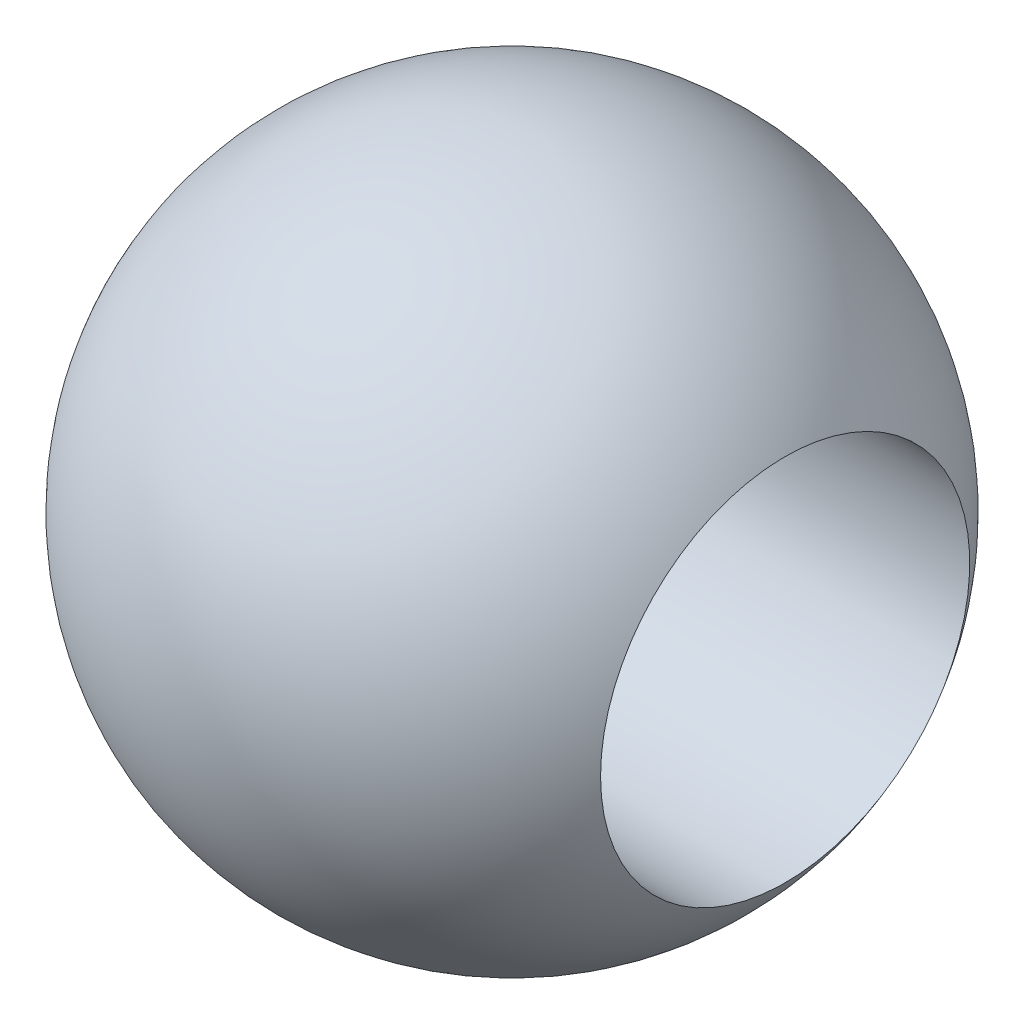
ISO-10303-21;
HEADER;
FILE_DESCRIPTION(('STEP AP214'),'2;1');
FILE_NAME('part.step','',(''),(''),'','','');
FILE_SCHEMA(('AUTOMOTIVE_DESIGN { 1 0 10303 214 1 1 1 1 }'));
ENDSEC;
DATA;
#1=APPLICATION_CONTEXT('core data for automotive mechanical design processes');
#2=APPLICATION_PROTOCOL_DEFINITION('international standard','automotive_design',2000,#1);
#3=PRODUCT_CONTEXT('',#1,'mechanical');
#4=PRODUCT('Part','Part','',(#3));
#5=PRODUCT_RELATED_PRODUCT_CATEGORY('part','',(#4));
#6=PRODUCT_DEFINITION_FORMATION('','',#4);
#7=PRODUCT_DEFINITION_CONTEXT('part definition',#1,'design');
#8=PRODUCT_DEFINITION('design','',#6,#7);
#9=PRODUCT_DEFINITION_SHAPE('','',#8);
#10=(LENGTH_UNIT() NAMED_UNIT(*) SI_UNIT(.MILLI.,.METRE.));
#11=(NAMED_UNIT(*) PLANE_ANGLE_UNIT() SI_UNIT($,.RADIAN.));
#12=(NAMED_UNIT(*) SI_UNIT($,.STERADIAN.) SOLID_ANGLE_UNIT());
#13=UNCERTAINTY_MEASURE_WITH_UNIT(LENGTH_MEASURE(1.E-05),#10,'distance_accuracy_value','');
#14=(GEOMETRIC_REPRESENTATION_CONTEXT(3) GLOBAL_UNCERTAINTY_ASSIGNED_CONTEXT((#13)) GLOBAL_UNIT_ASSIGNED_CONTEXT((#10,
#11,#12)) REPRESENTATION_CONTEXT('',''));
#15=CARTESIAN_POINT('',(0.,0.,0.));
#16=DIRECTION('',(0.,0.,1.));
#17=DIRECTION('',(1.,0.,0.));
#18=AXIS2_PLACEMENT_3D('',#15,#16,#17);
#19=CARTESIAN_POINT('',(0.,0.,0.));
#20=DIRECTION('',(0.,1.,0.));
#21=DIRECTION('',(1.,0.,0.));
#22=AXIS2_PLACEMENT_3D('',#19,#20,#21);
#23=SPHERICAL_SURFACE('',#22,12.5);
#24=CARTESIAN_POINT('',(0.,0.,0.));
#25=DIRECTION('',(-1.,0.,0.));
#26=DIRECTION('',(0.,0.,1.));
#27=AXIS2_PLACEMENT_3D('',#24,#25,#26);
#28=SPHERICAL_SURFACE('',#27,12.5);
#29=CARTESIAN_POINT('',(10.356157588604,0.,0.));
#30=DIRECTION('',(-1.,0.,0.));
#31=DIRECTION('',(0.,0.,1.));
#32=AXIS2_PLACEMENT_3D('',#29,#30,#31);
#33=CIRCLE('',#32,7.);
#34=CARTESIAN_POINT('',(10.356157588604,0.,7.));
#35=VERTEX_POINT('',#34);
#36=EDGE_CURVE('E10',#35,#35,#33,.F.);
#37=ORIENTED_EDGE('',*,*,#36,.F.);
#38=EDGE_LOOP('',(#37));
#39=FACE_BOUND('',#38,.T.);
#40=CARTESIAN_POINT('',(-10.356157588604,0.,0.));
#41=DIRECTION('',(1.,0.,0.));
#42=DIRECTION('',(0.,0.,-1.));
#43=AXIS2_PLACEMENT_3D('',#40,#41,#42);
#44=CIRCLE('',#43,7.);
#45=CARTESIAN_POINT('',(-10.356157588604,0.,-7.));
#46=VERTEX_POINT('',#45);
#47=EDGE_CURVE('E44',#46,#46,#44,.F.);
#48=ORIENTED_EDGE('',*,*,#47,.F.);
#49=EDGE_LOOP('',(#48));
#50=FACE_BOUND('',#49,.T.);
#51=ADVANCED_FACE('F37',(#39,#50),#28,.T.);
#52=CARTESIAN_POINT('',(-12.5,0.,0.));
#53=DIRECTION('',(1.,0.,0.));
#54=DIRECTION('',(0.,0.,-1.));
#55=AXIS2_PLACEMENT_3D('',#52,#53,#54);
#56=CYLINDRICAL_SURFACE('',#55,7.);
#57=ORIENTED_EDGE('',*,*,#36,.T.);
#58=EDGE_LOOP('',(#57));
#59=FACE_BOUND('',#58,.T.);
#60=ORIENTED_EDGE('',*,*,#47,.T.);
#61=EDGE_LOOP('',(#60));
#62=FACE_BOUND('',#61,.T.);
#63=ADVANCED_FACE('F51',(#59,#62),#56,.F.);
#64=CLOSED_SHELL('',(#51,#63));
#65=MANIFOLD_SOLID_BREP('B2',#64);
#66=ADVANCED_BREP_SHAPE_REPRESENTATION('',(#18,#65),#14);
#67=SHAPE_DEFINITION_REPRESENTATION(#9,#66);
ENDSEC;
END-ISO-10303-21;
